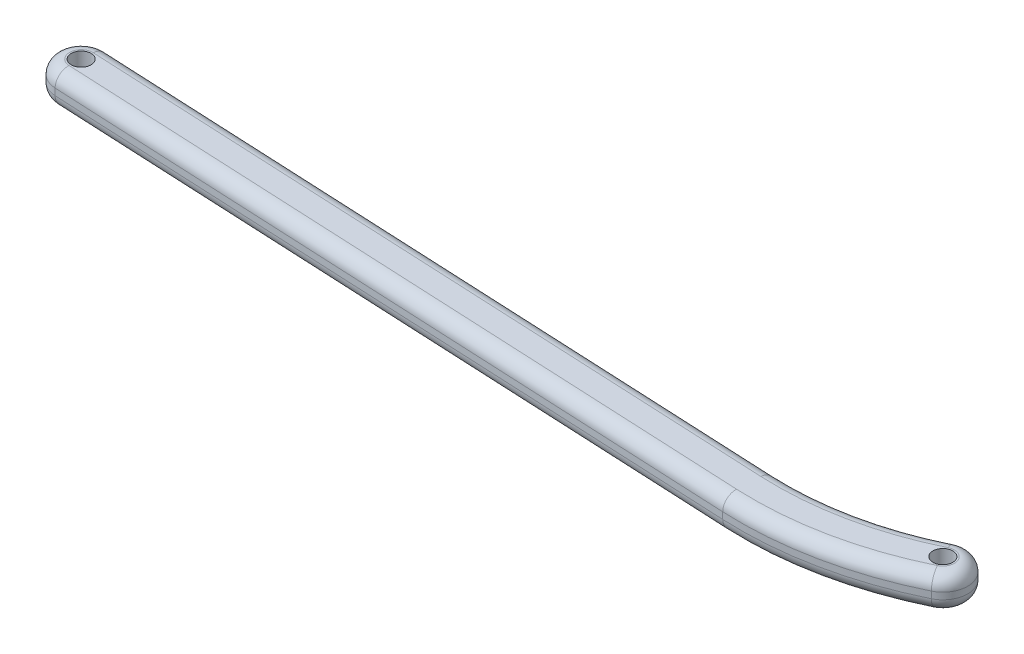
ISO-10303-21;
HEADER;
FILE_DESCRIPTION(('STEP AP214'),'2;1');
FILE_NAME('part.step','',(''),(''),'','','');
FILE_SCHEMA(('AUTOMOTIVE_DESIGN { 1 0 10303 214 1 1 1 1 }'));
ENDSEC;
DATA;
#1=APPLICATION_CONTEXT('core data for automotive mechanical design processes');
#2=APPLICATION_PROTOCOL_DEFINITION('international standard','automotive_design',2000,#1);
#3=PRODUCT_CONTEXT('',#1,'mechanical');
#4=PRODUCT('Part','Part','',(#3));
#5=PRODUCT_RELATED_PRODUCT_CATEGORY('part','',(#4));
#6=PRODUCT_DEFINITION_FORMATION('','',#4);
#7=PRODUCT_DEFINITION_CONTEXT('part definition',#1,'design');
#8=PRODUCT_DEFINITION('design','',#6,#7);
#9=PRODUCT_DEFINITION_SHAPE('','',#8);
#10=(LENGTH_UNIT() NAMED_UNIT(*) SI_UNIT(.MILLI.,.METRE.));
#11=(NAMED_UNIT(*) PLANE_ANGLE_UNIT() SI_UNIT($,.RADIAN.));
#12=(NAMED_UNIT(*) SI_UNIT($,.STERADIAN.) SOLID_ANGLE_UNIT());
#13=UNCERTAINTY_MEASURE_WITH_UNIT(LENGTH_MEASURE(1.E-05),#10,'distance_accuracy_value','');
#14=(GEOMETRIC_REPRESENTATION_CONTEXT(3) GLOBAL_UNCERTAINTY_ASSIGNED_CONTEXT((#13)) GLOBAL_UNIT_ASSIGNED_CONTEXT((#10,
#11,#12)) REPRESENTATION_CONTEXT('',''));
#15=CARTESIAN_POINT('',(0.,0.,0.));
#16=DIRECTION('',(0.,0.,1.));
#17=DIRECTION('',(1.,0.,0.));
#18=AXIS2_PLACEMENT_3D('',#15,#16,#17);
#19=CARTESIAN_POINT('',(0.,5.,0.));
#20=DIRECTION('',(0.,1.,0.));
#21=DIRECTION('',(0.,0.,1.));
#22=AXIS2_PLACEMENT_3D('',#19,#20,#21);
#23=PLANE('',#22);
#24=DIRECTION('',(0.998881638121411,0.,0.0472807891631148));
#25=VECTOR('',#24,1.);
#26=CARTESIAN_POINT('',(-48.7292519909867,5.,13.5041502197562));
#27=LINE('',#26,#25);
#28=CARTESIAN_POINT('',(-260.165482762071,5.,3.49608573342492));
#29=VERTEX_POINT('',#28);
#30=CARTESIAN_POINT('',(-48.7292519909867,5.,13.5041502197562));
#31=VERTEX_POINT('',#30);
#32=EDGE_CURVE('E58',#29,#31,#27,.T.);
#33=ORIENTED_EDGE('',*,*,#32,.T.);
#34=CARTESIAN_POINT('',(-43.8356903126043,5.,-89.8800993258099));
#35=DIRECTION('',(0.,1.,0.));
#36=DIRECTION('',(0.,0.,1.));
#37=AXIS2_PLACEMENT_3D('',#34,#35,#36);
#38=CIRCLE('',#37,103.5);
#39=CARTESIAN_POINT('',(1.53424916094115,5.,3.14580347640335));
#40=VERTEX_POINT('',#39);
#41=EDGE_CURVE('E141',#31,#40,#38,.T.);
#42=ORIENTED_EDGE('',*,*,#41,.T.);
#43=CARTESIAN_POINT('',(0.,5.,0.));
#44=DIRECTION('',(0.,1.,0.));
#45=DIRECTION('',(0.,0.,1.));
#46=AXIS2_PLACEMENT_3D('',#43,#44,#45);
#47=CIRCLE('',#46,3.5);
#48=CARTESIAN_POINT('',(-1.53424916094116,5.,-3.14580347640334));
#49=VERTEX_POINT('',#48);
#50=EDGE_CURVE('E165',#40,#49,#47,.T.);
#51=ORIENTED_EDGE('',*,*,#50,.T.);
#52=CARTESIAN_POINT('',(-43.8356903126043,5.,-89.8800993258099));
#53=DIRECTION('',(0.,1.,0.));
#54=DIRECTION('',(0.,0.,1.));
#55=AXIS2_PLACEMENT_3D('',#52,#53,#54);
#56=CIRCLE('',#55,96.5000000000001);
#57=CARTESIAN_POINT('',(-48.3982864668449,5.,6.51197875290634));
#58=VERTEX_POINT('',#57);
#59=EDGE_CURVE('E267',#49,#58,#56,.F.);
#60=ORIENTED_EDGE('',*,*,#59,.T.);
#61=DIRECTION('',(-0.998881638121411,0.,-0.0472807891631146));
#62=VECTOR('',#61,1.);
#63=CARTESIAN_POINT('',(-259.834517237929,5.,-3.49608573342493));
#64=LINE('',#63,#62);
#65=CARTESIAN_POINT('',(-259.834517237929,5.,-3.49608573342493));
#66=VERTEX_POINT('',#65);
#67=EDGE_CURVE('E269',#58,#66,#64,.T.);
#68=ORIENTED_EDGE('',*,*,#67,.T.);
#69=CARTESIAN_POINT('',(-260.,5.,0.));
#70=DIRECTION('',(0.,1.,0.));
#71=DIRECTION('',(0.,0.,1.));
#72=AXIS2_PLACEMENT_3D('',#69,#70,#71);
#73=CIRCLE('',#72,3.49999999999998);
#74=EDGE_CURVE('E63',#66,#29,#73,.T.);
#75=ORIENTED_EDGE('',*,*,#74,.T.);
#76=EDGE_LOOP('',(#33,#42,#51,#60,#68,#75));
#77=FACE_BOUND('',#76,.T.);
#78=CARTESIAN_POINT('',(0.,5.,0.));
#79=DIRECTION('',(0.,1.,0.));
#80=DIRECTION('',(0.,0.,1.));
#81=AXIS2_PLACEMENT_3D('',#78,#79,#80);
#82=CIRCLE('',#81,3.);
#83=CARTESIAN_POINT('',(0.,5.,3.));
#84=VERTEX_POINT('',#83);
#85=EDGE_CURVE('E154',#84,#84,#82,.T.);
#86=ORIENTED_EDGE('',*,*,#85,.F.);
#87=EDGE_LOOP('',(#86));
#88=FACE_BOUND('',#87,.T.);
#89=CARTESIAN_POINT('',(-260.,5.,0.));
#90=DIRECTION('',(0.,1.,0.));
#91=DIRECTION('',(0.,0.,1.));
#92=AXIS2_PLACEMENT_3D('',#89,#90,#91);
#93=CIRCLE('',#92,2.99999999999999);
#94=CARTESIAN_POINT('',(-260.,5.,2.99999999999999));
#95=VERTEX_POINT('',#94);
#96=EDGE_CURVE('E213',#95,#95,#93,.T.);
#97=ORIENTED_EDGE('',*,*,#96,.F.);
#98=EDGE_LOOP('',(#97));
#99=FACE_BOUND('',#98,.T.);
#100=ADVANCED_FACE('F41',(#77,#88,#99),#23,.T.);
#101=CARTESIAN_POINT('',(0.,-5.,0.));
#102=DIRECTION('',(0.,1.,0.));
#103=DIRECTION('',(0.,0.,1.));
#104=AXIS2_PLACEMENT_3D('',#101,#102,#103);
#105=PLANE('',#104);
#106=CARTESIAN_POINT('',(0.,-5.,0.));
#107=DIRECTION('',(0.,1.,0.));
#108=DIRECTION('',(0.,0.,1.));
#109=AXIS2_PLACEMENT_3D('',#106,#107,#108);
#110=CIRCLE('',#109,3.5);
#111=CARTESIAN_POINT('',(-1.53424916094116,-5.,-3.14580347640334));
#112=VERTEX_POINT('',#111);
#113=CARTESIAN_POINT('',(1.53424916094115,-5.,3.14580347640335));
#114=VERTEX_POINT('',#113);
#115=EDGE_CURVE('E237',#112,#114,#110,.F.);
#116=ORIENTED_EDGE('',*,*,#115,.T.);
#117=CARTESIAN_POINT('',(-43.8356903126043,-5.,-89.8800993258099));
#118=DIRECTION('',(0.,1.,0.));
#119=DIRECTION('',(0.,0.,1.));
#120=AXIS2_PLACEMENT_3D('',#117,#118,#119);
#121=CIRCLE('',#120,103.5);
#122=CARTESIAN_POINT('',(-48.7292519909867,-5.,13.5041502197562));
#123=VERTEX_POINT('',#122);
#124=EDGE_CURVE('E247',#114,#123,#121,.F.);
#125=ORIENTED_EDGE('',*,*,#124,.T.);
#126=DIRECTION('',(0.998881638121411,0.,0.0472807891631148));
#127=VECTOR('',#126,1.);
#128=CARTESIAN_POINT('',(-0.746705748281499,-5.,15.7753428874655));
#129=LINE('',#128,#127);
#130=CARTESIAN_POINT('',(-260.165482762071,-5.,3.49608573342492));
#131=VERTEX_POINT('',#130);
#132=EDGE_CURVE('E245',#123,#131,#129,.F.);
#133=ORIENTED_EDGE('',*,*,#132,.T.);
#134=CARTESIAN_POINT('',(-260.,-5.,0.));
#135=DIRECTION('',(0.,1.,0.));
#136=DIRECTION('',(0.,0.,1.));
#137=AXIS2_PLACEMENT_3D('',#134,#135,#136);
#138=CIRCLE('',#137,3.49999999999998);
#139=CARTESIAN_POINT('',(-259.834517237929,-5.,-3.49608573342492));
#140=VERTEX_POINT('',#139);
#141=EDGE_CURVE('E243',#131,#140,#138,.F.);
#142=ORIENTED_EDGE('',*,*,#141,.T.);
#143=DIRECTION('',(-0.998881638121411,0.,-0.0472807891631146));
#144=VECTOR('',#143,1.);
#145=CARTESIAN_POINT('',(-0.415740224139692,-5.,8.78317142061556));
#146=LINE('',#145,#144);
#147=CARTESIAN_POINT('',(-48.3982864668449,-5.,6.51197875290634));
#148=VERTEX_POINT('',#147);
#149=EDGE_CURVE('E241',#140,#148,#146,.F.);
#150=ORIENTED_EDGE('',*,*,#149,.T.);
#151=CARTESIAN_POINT('',(-43.8356903126043,-5.,-89.8800993258099));
#152=DIRECTION('',(0.,1.,0.));
#153=DIRECTION('',(0.,0.,1.));
#154=AXIS2_PLACEMENT_3D('',#151,#152,#153);
#155=CIRCLE('',#154,96.5000000000001);
#156=EDGE_CURVE('E239',#148,#112,#155,.T.);
#157=ORIENTED_EDGE('',*,*,#156,.T.);
#158=EDGE_LOOP('',(#116,#125,#133,#142,#150,#157));
#159=FACE_BOUND('',#158,.T.);
#160=CARTESIAN_POINT('',(0.,-5.,0.));
#161=DIRECTION('',(0.,1.,0.));
#162=DIRECTION('',(0.,0.,1.));
#163=AXIS2_PLACEMENT_3D('',#160,#161,#162);
#164=CIRCLE('',#163,3.);
#165=CARTESIAN_POINT('',(0.,-5.,3.));
#166=VERTEX_POINT('',#165);
#167=EDGE_CURVE('E218',#166,#166,#164,.T.);
#168=ORIENTED_EDGE('',*,*,#167,.T.);
#169=EDGE_LOOP('',(#168));
#170=FACE_BOUND('',#169,.T.);
#171=CARTESIAN_POINT('',(-260.,-5.,0.));
#172=DIRECTION('',(0.,1.,0.));
#173=DIRECTION('',(0.,0.,1.));
#174=AXIS2_PLACEMENT_3D('',#171,#172,#173);
#175=CIRCLE('',#174,2.99999999999999);
#176=CARTESIAN_POINT('',(-260.,-5.,2.99999999999999));
#177=VERTEX_POINT('',#176);
#178=EDGE_CURVE('E207',#177,#177,#175,.T.);
#179=ORIENTED_EDGE('',*,*,#178,.T.);
#180=EDGE_LOOP('',(#179));
#181=FACE_BOUND('',#180,.T.);
#182=ADVANCED_FACE('F311',(#159,#170,#181),#105,.F.);
#183=CARTESIAN_POINT('',(0.,5.,0.));
#184=DIRECTION('',(0.,-1.,0.));
#185=DIRECTION('',(0.,0.,-1.));
#186=AXIS2_PLACEMENT_3D('',#183,#184,#185);
#187=CYLINDRICAL_SURFACE('',#186,7.5);
#188=DIRECTION('',(0.,-1.,0.));
#189=VECTOR('',#188,1.);
#190=CARTESIAN_POINT('',(3.28767677344535,5.,6.7410074494358));
#191=LINE('',#190,#189);
#192=CARTESIAN_POINT('',(3.28767677344535,1.,6.7410074494358));
#193=VERTEX_POINT('',#192);
#194=CARTESIAN_POINT('',(3.28767677344535,-1.,6.7410074494358));
#195=VERTEX_POINT('',#194);
#196=EDGE_CURVE('E134',#193,#195,#191,.T.);
#197=ORIENTED_EDGE('',*,*,#196,.T.);
#198=CARTESIAN_POINT('',(0.,-1.,0.));
#199=DIRECTION('',(0.,1.,0.));
#200=DIRECTION('',(0.,0.,1.));
#201=AXIS2_PLACEMENT_3D('',#198,#199,#200);
#202=CIRCLE('',#201,7.5);
#203=CARTESIAN_POINT('',(-3.28767677344531,-1.,-6.74100744943569));
#204=VERTEX_POINT('',#203);
#205=EDGE_CURVE('E11',#195,#204,#202,.T.);
#206=ORIENTED_EDGE('',*,*,#205,.T.);
#207=DIRECTION('',(0.,-1.,0.));
#208=VECTOR('',#207,1.);
#209=CARTESIAN_POINT('',(-3.28767677344531,5.,-6.74100744943569));
#210=LINE('',#209,#208);
#211=CARTESIAN_POINT('',(-3.28767677344531,1.,-6.74100744943569));
#212=VERTEX_POINT('',#211);
#213=EDGE_CURVE('E136',#212,#204,#210,.T.);
#214=ORIENTED_EDGE('',*,*,#213,.F.);
#215=CARTESIAN_POINT('',(0.,1.,0.));
#216=DIRECTION('',(0.,1.,0.));
#217=DIRECTION('',(0.,0.,1.));
#218=AXIS2_PLACEMENT_3D('',#215,#216,#217);
#219=CIRCLE('',#218,7.5);
#220=EDGE_CURVE('E50',#212,#193,#219,.F.);
#221=ORIENTED_EDGE('',*,*,#220,.T.);
#222=EDGE_LOOP('',(#197,#206,#214,#221));
#223=FACE_BOUND('',#222,.T.);
#224=ADVANCED_FACE('F133',(#223),#187,.T.);
#225=CARTESIAN_POINT('',(-43.8356903126043,5.,-89.8800993258099));
#226=DIRECTION('',(0.,-1.,0.));
#227=DIRECTION('',(0.,0.,-1.));
#228=AXIS2_PLACEMENT_3D('',#225,#226,#227);
#229=CYLINDRICAL_SURFACE('',#228,92.5000000000001);
#230=ORIENTED_EDGE('',*,*,#213,.T.);
#231=CARTESIAN_POINT('',(-43.8356903126043,-1.,-89.8800993258099));
#232=DIRECTION('',(0.,1.,0.));
#233=DIRECTION('',(0.,0.,1.));
#234=AXIS2_PLACEMENT_3D('',#231,#232,#233);
#235=CIRCLE('',#234,92.5000000000001);
#236=CARTESIAN_POINT('',(-48.2091633101924,-1.,2.51645220042068));
#237=VERTEX_POINT('',#236);
#238=EDGE_CURVE('E264',#204,#237,#235,.F.);
#239=ORIENTED_EDGE('',*,*,#238,.T.);
#240=DIRECTION('',(0.,-1.,0.));
#241=VECTOR('',#240,1.);
#242=CARTESIAN_POINT('',(-48.2091633101924,5.,2.51645220042068));
#243=LINE('',#242,#241);
#244=CARTESIAN_POINT('',(-48.2091633101924,1.,2.51645220042068));
#245=VERTEX_POINT('',#244);
#246=EDGE_CURVE('E232',#245,#237,#243,.T.);
#247=ORIENTED_EDGE('',*,*,#246,.F.);
#248=CARTESIAN_POINT('',(-43.8356903126043,1.,-89.8800993258099));
#249=DIRECTION('',(0.,1.,0.));
#250=DIRECTION('',(0.,0.,1.));
#251=AXIS2_PLACEMENT_3D('',#248,#249,#250);
#252=CIRCLE('',#251,92.5000000000001);
#253=EDGE_CURVE('E262',#245,#212,#252,.T.);
#254=ORIENTED_EDGE('',*,*,#253,.T.);
#255=EDGE_LOOP('',(#230,#239,#247,#254));
#256=FACE_BOUND('',#255,.T.);
#257=ADVANCED_FACE('F278',(#256),#229,.F.);
#258=CARTESIAN_POINT('',(-48.2091633101924,5.,2.51645220042068));
#259=DIRECTION('',(-0.0472807891631146,0.,0.998881638121411));
#260=DIRECTION('',(0.998881638121411,0.,0.0472807891631146));
#261=AXIS2_PLACEMENT_3D('',#258,#259,#260);
#262=PLANE('',#261);
#263=ORIENTED_EDGE('',*,*,#246,.T.);
#264=DIRECTION('',(-0.998881638121411,0.,-0.0472807891631146));
#265=VECTOR('',#264,1.);
#266=CARTESIAN_POINT('',(-48.2091633101924,-1.,2.51645220042068));
#267=LINE('',#266,#265);
#268=CARTESIAN_POINT('',(-259.645394081277,-1.,-7.49161228591057));
#269=VERTEX_POINT('',#268);
#270=EDGE_CURVE('E260',#237,#269,#267,.T.);
#271=ORIENTED_EDGE('',*,*,#270,.T.);
#272=DIRECTION('',(0.,-1.,0.));
#273=VECTOR('',#272,1.);
#274=CARTESIAN_POINT('',(-259.645394081277,5.,-7.49161228591057));
#275=LINE('',#274,#273);
#276=CARTESIAN_POINT('',(-259.645394081277,1.,-7.49161228591057));
#277=VERTEX_POINT('',#276);
#278=EDGE_CURVE('E229',#277,#269,#275,.T.);
#279=ORIENTED_EDGE('',*,*,#278,.F.);
#280=DIRECTION('',(-0.998881638121411,0.,-0.0472807891631146));
#281=VECTOR('',#280,1.);
#282=CARTESIAN_POINT('',(-48.2091633101924,1.,2.51645220042068));
#283=LINE('',#282,#281);
#284=EDGE_CURVE('E258',#277,#245,#283,.F.);
#285=ORIENTED_EDGE('',*,*,#284,.T.);
#286=EDGE_LOOP('',(#263,#271,#279,#285));
#287=FACE_BOUND('',#286,.T.);
#288=ADVANCED_FACE('F329',(#287),#262,.F.);
#289=CARTESIAN_POINT('',(-260.,5.,0.));
#290=DIRECTION('',(0.,-1.,0.));
#291=DIRECTION('',(0.,0.,-1.));
#292=AXIS2_PLACEMENT_3D('',#289,#290,#291);
#293=CYLINDRICAL_SURFACE('',#292,7.49999999999998);
#294=ORIENTED_EDGE('',*,*,#278,.T.);
#295=CARTESIAN_POINT('',(-260.,-1.,0.));
#296=DIRECTION('',(0.,1.,0.));
#297=DIRECTION('',(0.,0.,1.));
#298=AXIS2_PLACEMENT_3D('',#295,#296,#297);
#299=CIRCLE('',#298,7.49999999999998);
#300=CARTESIAN_POINT('',(-260.354605918723,-1.,7.49161228591056));
#301=VERTEX_POINT('',#300);
#302=EDGE_CURVE('E256',#269,#301,#299,.T.);
#303=ORIENTED_EDGE('',*,*,#302,.T.);
#304=DIRECTION('',(0.,-1.,0.));
#305=VECTOR('',#304,1.);
#306=CARTESIAN_POINT('',(-260.354605918723,5.,7.49161228591056));
#307=LINE('',#306,#305);
#308=CARTESIAN_POINT('',(-260.354605918723,1.,7.49161228591056));
#309=VERTEX_POINT('',#308);
#310=EDGE_CURVE('E226',#309,#301,#307,.T.);
#311=ORIENTED_EDGE('',*,*,#310,.F.);
#312=CARTESIAN_POINT('',(-260.,1.,0.));
#313=DIRECTION('',(0.,1.,0.));
#314=DIRECTION('',(0.,0.,1.));
#315=AXIS2_PLACEMENT_3D('',#312,#313,#314);
#316=CIRCLE('',#315,7.49999999999998);
#317=EDGE_CURVE('E254',#309,#277,#316,.F.);
#318=ORIENTED_EDGE('',*,*,#317,.T.);
#319=EDGE_LOOP('',(#294,#303,#311,#318));
#320=FACE_BOUND('',#319,.T.);
#321=ADVANCED_FACE('F291',(#320),#293,.T.);
#322=CARTESIAN_POINT('',(-48.9183751476391,5.,17.4996767722419));
#323=DIRECTION('',(0.0472807891631148,0.,-0.998881638121411));
#324=DIRECTION('',(-0.998881638121411,0.,-0.0472807891631148));
#325=AXIS2_PLACEMENT_3D('',#322,#323,#324);
#326=PLANE('',#325);
#327=ORIENTED_EDGE('',*,*,#310,.T.);
#328=DIRECTION('',(0.998881638121411,0.,0.0472807891631148));
#329=VECTOR('',#328,1.);
#330=CARTESIAN_POINT('',(-48.9183751476391,-1.,17.4996767722419));
#331=LINE('',#330,#329);
#332=CARTESIAN_POINT('',(-48.9183751476391,-1.,17.4996767722419));
#333=VERTEX_POINT('',#332);
#334=EDGE_CURVE('E252',#301,#333,#331,.T.);
#335=ORIENTED_EDGE('',*,*,#334,.T.);
#336=DIRECTION('',(0.,-1.,0.));
#337=VECTOR('',#336,1.);
#338=CARTESIAN_POINT('',(-48.9183751476391,5.,17.4996767722419));
#339=LINE('',#338,#337);
#340=CARTESIAN_POINT('',(-48.9183751476391,1.,17.4996767722419));
#341=VERTEX_POINT('',#340);
#342=EDGE_CURVE('E153',#341,#333,#339,.T.);
#343=ORIENTED_EDGE('',*,*,#342,.F.);
#344=DIRECTION('',(0.998881638121411,0.,0.0472807891631148));
#345=VECTOR('',#344,1.);
#346=CARTESIAN_POINT('',(-260.354605918723,1.,7.49161228591056));
#347=LINE('',#346,#345);
#348=EDGE_CURVE('E250',#341,#309,#347,.F.);
#349=ORIENTED_EDGE('',*,*,#348,.T.);
#350=EDGE_LOOP('',(#327,#335,#343,#349));
#351=FACE_BOUND('',#350,.T.);
#352=ADVANCED_FACE('F288',(#351),#326,.F.);
#353=CARTESIAN_POINT('',(-43.8356903126043,5.,-89.8800993258099));
#354=DIRECTION('',(0.,-1.,0.));
#355=DIRECTION('',(0.,0.,-1.));
#356=AXIS2_PLACEMENT_3D('',#353,#354,#355);
#357=CYLINDRICAL_SURFACE('',#356,107.5);
#358=ORIENTED_EDGE('',*,*,#342,.T.);
#359=CARTESIAN_POINT('',(-43.8356903126043,-1.,-89.8800993258099));
#360=DIRECTION('',(0.,1.,0.));
#361=DIRECTION('',(0.,0.,1.));
#362=AXIS2_PLACEMENT_3D('',#359,#360,#361);
#363=CIRCLE('',#362,107.5);
#364=EDGE_CURVE('E152',#333,#195,#363,.T.);
#365=ORIENTED_EDGE('',*,*,#364,.T.);
#366=ORIENTED_EDGE('',*,*,#196,.F.);
#367=CARTESIAN_POINT('',(-43.8356903126043,1.,-89.8800993258099));
#368=DIRECTION('',(0.,1.,0.));
#369=DIRECTION('',(0.,0.,1.));
#370=AXIS2_PLACEMENT_3D('',#367,#368,#369);
#371=CIRCLE('',#370,107.5);
#372=EDGE_CURVE('E149',#193,#341,#371,.F.);
#373=ORIENTED_EDGE('',*,*,#372,.T.);
#374=EDGE_LOOP('',(#358,#365,#366,#373));
#375=FACE_BOUND('',#374,.T.);
#376=ADVANCED_FACE('F148',(#375),#357,.T.);
#377=CARTESIAN_POINT('',(0.,5.,0.));
#378=DIRECTION('',(0.,-1.,0.));
#379=DIRECTION('',(0.,0.,-1.));
#380=AXIS2_PLACEMENT_3D('',#377,#378,#379);
#381=CYLINDRICAL_SURFACE('',#380,3.);
#382=ORIENTED_EDGE('',*,*,#85,.T.);
#383=EDGE_LOOP('',(#382));
#384=FACE_BOUND('',#383,.T.);
#385=ORIENTED_EDGE('',*,*,#167,.F.);
#386=EDGE_LOOP('',(#385));
#387=FACE_BOUND('',#386,.T.);
#388=ADVANCED_FACE('F320',(#384,#387),#381,.F.);
#389=CARTESIAN_POINT('',(-260.,5.,0.));
#390=DIRECTION('',(0.,-1.,0.));
#391=DIRECTION('',(0.,0.,-1.));
#392=AXIS2_PLACEMENT_3D('',#389,#390,#391);
#393=CYLINDRICAL_SURFACE('',#392,2.99999999999999);
#394=ORIENTED_EDGE('',*,*,#96,.T.);
#395=EDGE_LOOP('',(#394));
#396=FACE_BOUND('',#395,.T.);
#397=ORIENTED_EDGE('',*,*,#178,.F.);
#398=EDGE_LOOP('',(#397));
#399=FACE_BOUND('',#398,.T.);
#400=ADVANCED_FACE('F372',(#396,#399),#393,.F.);
#401=CARTESIAN_POINT('',(-48.3982864668449,-1.,6.51197875290633));
#402=DIRECTION('',(-0.998881638121411,0.,-0.0472807891631146));
#403=DIRECTION('',(-0.0472807891631146,0.,0.998881638121411));
#404=AXIS2_PLACEMENT_3D('',#401,#402,#403);
#405=CYLINDRICAL_SURFACE('',#404,4.);
#406=CARTESIAN_POINT('',(-48.3982864668449,-1.,6.51197875290633));
#407=DIRECTION('',(0.998881638121411,0.,0.0472807891631153));
#408=DIRECTION('',(0.0472807891631153,0.,-0.998881638121411));
#409=AXIS2_PLACEMENT_3D('',#406,#407,#408);
#410=CIRCLE('',#409,4.);
#411=EDGE_CURVE('E200',#148,#237,#410,.T.);
#412=ORIENTED_EDGE('',*,*,#411,.F.);
#413=ORIENTED_EDGE('',*,*,#149,.F.);
#414=CARTESIAN_POINT('',(-259.834517237929,-1.,-3.49608573342492));
#415=DIRECTION('',(-0.998881638121411,0.,-0.0472807891631205));
#416=DIRECTION('',(-0.0472807891631205,0.,0.998881638121411));
#417=AXIS2_PLACEMENT_3D('',#414,#415,#416);
#418=CIRCLE('',#417,4.);
#419=EDGE_CURVE('E170',#269,#140,#418,.T.);
#420=ORIENTED_EDGE('',*,*,#419,.F.);
#421=ORIENTED_EDGE('',*,*,#270,.F.);
#422=EDGE_LOOP('',(#412,#413,#420,#421));
#423=FACE_BOUND('',#422,.T.);
#424=ADVANCED_FACE('F368',(#423),#405,.T.);
#425=CARTESIAN_POINT('',(-260.,-1.,0.));
#426=DIRECTION('',(0.,1.,0.));
#427=DIRECTION('',(0.,0.,1.));
#428=AXIS2_PLACEMENT_3D('',#425,#426,#427);
#429=DEGENERATE_TOROIDAL_SURFACE('',#428,3.49999999999998,4.,.T.);
#430=ORIENTED_EDGE('',*,*,#419,.T.);
#431=ORIENTED_EDGE('',*,*,#141,.F.);
#432=CARTESIAN_POINT('',(-260.165482762071,-1.,3.49608573342492));
#433=DIRECTION('',(0.998881638121411,0.,0.0472807891631205));
#434=DIRECTION('',(0.0472807891631205,0.,-0.998881638121411));
#435=AXIS2_PLACEMENT_3D('',#432,#433,#434);
#436=CIRCLE('',#435,4.);
#437=EDGE_CURVE('E198',#301,#131,#436,.T.);
#438=ORIENTED_EDGE('',*,*,#437,.F.);
#439=ORIENTED_EDGE('',*,*,#302,.F.);
#440=EDGE_LOOP('',(#430,#431,#438,#439));
#441=FACE_BOUND('',#440,.T.);
#442=ADVANCED_FACE('F293',(#441),#429,.T.);
#443=CARTESIAN_POINT('',(-43.8356903126043,-1.,-89.8800993258099));
#444=DIRECTION('',(0.,1.,0.));
#445=DIRECTION('',(0.,0.,1.));
#446=AXIS2_PLACEMENT_3D('',#443,#444,#445);
#447=TOROIDAL_SURFACE('',#446,96.5000000000001,4.);
#448=ORIENTED_EDGE('',*,*,#411,.T.);
#449=ORIENTED_EDGE('',*,*,#238,.F.);
#450=CARTESIAN_POINT('',(-1.53424916094114,-1.,-3.1458034764033));
#451=DIRECTION('',(0.898800993258099,0.,-0.438356903126043));
#452=DIRECTION('',(-0.438356903126043,0.,-0.898800993258099));
#453=AXIS2_PLACEMENT_3D('',#450,#451,#452);
#454=CIRCLE('',#453,4.);
#455=EDGE_CURVE('E193',#112,#204,#454,.T.);
#456=ORIENTED_EDGE('',*,*,#455,.F.);
#457=ORIENTED_EDGE('',*,*,#156,.F.);
#458=EDGE_LOOP('',(#448,#449,#456,#457));
#459=FACE_BOUND('',#458,.T.);
#460=ADVANCED_FACE('F382',(#459),#447,.T.);
#461=CARTESIAN_POINT('',(-48.7292519909867,-1.,13.5041502197562));
#462=DIRECTION('',(0.998881638121411,0.,0.0472807891631148));
#463=DIRECTION('',(0.0472807891631148,0.,-0.998881638121411));
#464=AXIS2_PLACEMENT_3D('',#461,#462,#463);
#465=CYLINDRICAL_SURFACE('',#464,4.);
#466=ORIENTED_EDGE('',*,*,#437,.T.);
#467=ORIENTED_EDGE('',*,*,#132,.F.);
#468=CARTESIAN_POINT('',(-48.7292519909867,-1.,13.5041502197562));
#469=DIRECTION('',(0.998881638121411,0.,0.0472807891631153));
#470=DIRECTION('',(0.0472807891631153,0.,-0.998881638121411));
#471=AXIS2_PLACEMENT_3D('',#468,#469,#470);
#472=CIRCLE('',#471,4.);
#473=EDGE_CURVE('E187',#333,#123,#472,.T.);
#474=ORIENTED_EDGE('',*,*,#473,.F.);
#475=ORIENTED_EDGE('',*,*,#334,.F.);
#476=EDGE_LOOP('',(#466,#467,#474,#475));
#477=FACE_BOUND('',#476,.T.);
#478=ADVANCED_FACE('F298',(#477),#465,.T.);
#479=CARTESIAN_POINT('',(0.,-1.,0.));
#480=DIRECTION('',(0.,1.,0.));
#481=DIRECTION('',(0.,0.,1.));
#482=AXIS2_PLACEMENT_3D('',#479,#480,#481);
#483=DEGENERATE_TOROIDAL_SURFACE('',#482,3.5,4.,.T.);
#484=ORIENTED_EDGE('',*,*,#455,.T.);
#485=ORIENTED_EDGE('',*,*,#205,.F.);
#486=CARTESIAN_POINT('',(1.53424916094115,-1.,3.14580347640335));
#487=DIRECTION('',(-0.898800993258099,0.,0.438356903126043));
#488=DIRECTION('',(0.438356903126043,0.,0.898800993258099));
#489=AXIS2_PLACEMENT_3D('',#486,#487,#488);
#490=CIRCLE('',#489,4.);
#491=EDGE_CURVE('E183',#114,#195,#490,.T.);
#492=ORIENTED_EDGE('',*,*,#491,.F.);
#493=ORIENTED_EDGE('',*,*,#115,.F.);
#494=EDGE_LOOP('',(#484,#485,#492,#493));
#495=FACE_BOUND('',#494,.T.);
#496=ADVANCED_FACE('F301',(#495),#483,.T.);
#497=CARTESIAN_POINT('',(-43.8356903126043,-1.,-89.8800993258099));
#498=DIRECTION('',(0.,1.,0.));
#499=DIRECTION('',(0.,0.,1.));
#500=AXIS2_PLACEMENT_3D('',#497,#498,#499);
#501=TOROIDAL_SURFACE('',#500,103.5,4.);
#502=ORIENTED_EDGE('',*,*,#473,.T.);
#503=ORIENTED_EDGE('',*,*,#124,.F.);
#504=ORIENTED_EDGE('',*,*,#491,.T.);
#505=ORIENTED_EDGE('',*,*,#364,.F.);
#506=EDGE_LOOP('',(#502,#503,#504,#505));
#507=FACE_BOUND('',#506,.T.);
#508=ADVANCED_FACE('F299',(#507),#501,.T.);
#509=CARTESIAN_POINT('',(-0.415740224139692,1.,8.78317142061556));
#510=DIRECTION('',(0.998881638121411,0.,0.0472807891631146));
#511=DIRECTION('',(0.0472807891631146,0.,-0.998881638121411));
#512=AXIS2_PLACEMENT_3D('',#509,#510,#511);
#513=CYLINDRICAL_SURFACE('',#512,4.);
#514=CARTESIAN_POINT('',(-48.3982864668449,1.,6.51197875290633));
#515=DIRECTION('',(0.998881638121411,0.,0.0472807891631153));
#516=DIRECTION('',(0.0472807891631153,0.,-0.998881638121411));
#517=AXIS2_PLACEMENT_3D('',#514,#515,#516);
#518=CIRCLE('',#517,4.);
#519=EDGE_CURVE('E176',#245,#58,#518,.T.);
#520=ORIENTED_EDGE('',*,*,#519,.F.);
#521=ORIENTED_EDGE('',*,*,#284,.F.);
#522=CARTESIAN_POINT('',(-259.834517237929,1.,-3.49608573342493));
#523=DIRECTION('',(-0.998881638121411,0.,-0.0472807891631205));
#524=DIRECTION('',(-0.0472807891631205,0.,0.998881638121411));
#525=AXIS2_PLACEMENT_3D('',#522,#523,#524);
#526=CIRCLE('',#525,4.);
#527=EDGE_CURVE('E45',#66,#277,#526,.T.);
#528=ORIENTED_EDGE('',*,*,#527,.F.);
#529=ORIENTED_EDGE('',*,*,#67,.F.);
#530=EDGE_LOOP('',(#520,#521,#528,#529));
#531=FACE_BOUND('',#530,.T.);
#532=ADVANCED_FACE('F43',(#531),#513,.T.);
#533=CARTESIAN_POINT('',(-260.,1.,0.));
#534=DIRECTION('',(0.,1.,0.));
#535=DIRECTION('',(0.,0.,1.));
#536=AXIS2_PLACEMENT_3D('',#533,#534,#535);
#537=DEGENERATE_TOROIDAL_SURFACE('',#536,3.49999999999998,4.,.T.);
#538=ORIENTED_EDGE('',*,*,#527,.T.);
#539=ORIENTED_EDGE('',*,*,#317,.F.);
#540=CARTESIAN_POINT('',(-260.165482762071,1.,3.49608573342492));
#541=DIRECTION('',(0.998881638121411,0.,0.0472807891631205));
#542=DIRECTION('',(0.0472807891631205,0.,-0.998881638121411));
#543=AXIS2_PLACEMENT_3D('',#540,#541,#542);
#544=CIRCLE('',#543,4.);
#545=EDGE_CURVE('E174',#29,#309,#544,.T.);
#546=ORIENTED_EDGE('',*,*,#545,.F.);
#547=ORIENTED_EDGE('',*,*,#74,.F.);
#548=EDGE_LOOP('',(#538,#539,#546,#547));
#549=FACE_BOUND('',#548,.T.);
#550=ADVANCED_FACE('F283',(#549),#537,.T.);
#551=CARTESIAN_POINT('',(-43.8356903126043,1.,-89.8800993258099));
#552=DIRECTION('',(0.,1.,0.));
#553=DIRECTION('',(0.,0.,1.));
#554=AXIS2_PLACEMENT_3D('',#551,#552,#553);
#555=TOROIDAL_SURFACE('',#554,96.5000000000001,4.);
#556=ORIENTED_EDGE('',*,*,#519,.T.);
#557=ORIENTED_EDGE('',*,*,#59,.F.);
#558=CARTESIAN_POINT('',(-1.53424916094114,1.,-3.1458034764033));
#559=DIRECTION('',(0.898800993258099,0.,-0.438356903126043));
#560=DIRECTION('',(-0.438356903126043,0.,-0.898800993258099));
#561=AXIS2_PLACEMENT_3D('',#558,#559,#560);
#562=CIRCLE('',#561,4.);
#563=EDGE_CURVE('E167',#212,#49,#562,.T.);
#564=ORIENTED_EDGE('',*,*,#563,.F.);
#565=ORIENTED_EDGE('',*,*,#253,.F.);
#566=EDGE_LOOP('',(#556,#557,#564,#565));
#567=FACE_BOUND('',#566,.T.);
#568=ADVANCED_FACE('F275',(#567),#555,.T.);
#569=CARTESIAN_POINT('',(-0.746705748281499,1.,15.7753428874655));
#570=DIRECTION('',(-0.998881638121411,0.,-0.0472807891631148));
#571=DIRECTION('',(-0.0472807891631148,0.,0.998881638121411));
#572=AXIS2_PLACEMENT_3D('',#569,#570,#571);
#573=CYLINDRICAL_SURFACE('',#572,4.);
#574=ORIENTED_EDGE('',*,*,#545,.T.);
#575=ORIENTED_EDGE('',*,*,#348,.F.);
#576=CARTESIAN_POINT('',(-48.7292519909867,1.,13.5041502197562));
#577=DIRECTION('',(0.998881638121411,0.,0.0472807891631153));
#578=DIRECTION('',(0.0472807891631153,0.,-0.998881638121411));
#579=AXIS2_PLACEMENT_3D('',#576,#577,#578);
#580=CIRCLE('',#579,4.);
#581=EDGE_CURVE('E161',#31,#341,#580,.T.);
#582=ORIENTED_EDGE('',*,*,#581,.F.);
#583=ORIENTED_EDGE('',*,*,#32,.F.);
#584=EDGE_LOOP('',(#574,#575,#582,#583));
#585=FACE_BOUND('',#584,.T.);
#586=ADVANCED_FACE('F285',(#585),#573,.T.);
#587=CARTESIAN_POINT('',(0.,1.,0.));
#588=DIRECTION('',(0.,1.,0.));
#589=DIRECTION('',(0.,0.,1.));
#590=AXIS2_PLACEMENT_3D('',#587,#588,#589);
#591=DEGENERATE_TOROIDAL_SURFACE('',#590,3.5,4.,.T.);
#592=ORIENTED_EDGE('',*,*,#563,.T.);
#593=ORIENTED_EDGE('',*,*,#50,.F.);
#594=CARTESIAN_POINT('',(1.53424916094115,1.,3.14580347640335));
#595=DIRECTION('',(-0.898800993258099,0.,0.438356903126042));
#596=DIRECTION('',(0.438356903126042,0.,0.898800993258099));
#597=AXIS2_PLACEMENT_3D('',#594,#595,#596);
#598=CIRCLE('',#597,4.);
#599=EDGE_CURVE('E159',#193,#40,#598,.T.);
#600=ORIENTED_EDGE('',*,*,#599,.F.);
#601=ORIENTED_EDGE('',*,*,#220,.F.);
#602=EDGE_LOOP('',(#592,#593,#600,#601));
#603=FACE_BOUND('',#602,.T.);
#604=ADVANCED_FACE('F164',(#603),#591,.T.);
#605=CARTESIAN_POINT('',(-43.8356903126043,1.,-89.8800993258099));
#606=DIRECTION('',(0.,1.,0.));
#607=DIRECTION('',(0.,0.,1.));
#608=AXIS2_PLACEMENT_3D('',#605,#606,#607);
#609=TOROIDAL_SURFACE('',#608,103.5,4.);
#610=ORIENTED_EDGE('',*,*,#581,.T.);
#611=ORIENTED_EDGE('',*,*,#372,.F.);
#612=ORIENTED_EDGE('',*,*,#599,.T.);
#613=ORIENTED_EDGE('',*,*,#41,.F.);
#614=EDGE_LOOP('',(#610,#611,#612,#613));
#615=FACE_BOUND('',#614,.T.);
#616=ADVANCED_FACE('F157',(#615),#609,.T.);
#617=CLOSED_SHELL('',(#100,#182,#224,#257,#288,#321,#352,#376,#388,#400,#424,#442,#460,#478,
#496,#508,#532,#550,#568,#586,#604,#616));
#618=MANIFOLD_SOLID_BREP('B2',#617);
#619=ADVANCED_BREP_SHAPE_REPRESENTATION('',(#18,#618),#14);
#620=SHAPE_DEFINITION_REPRESENTATION(#9,#619);
ENDSEC;
END-ISO-10303-21;
